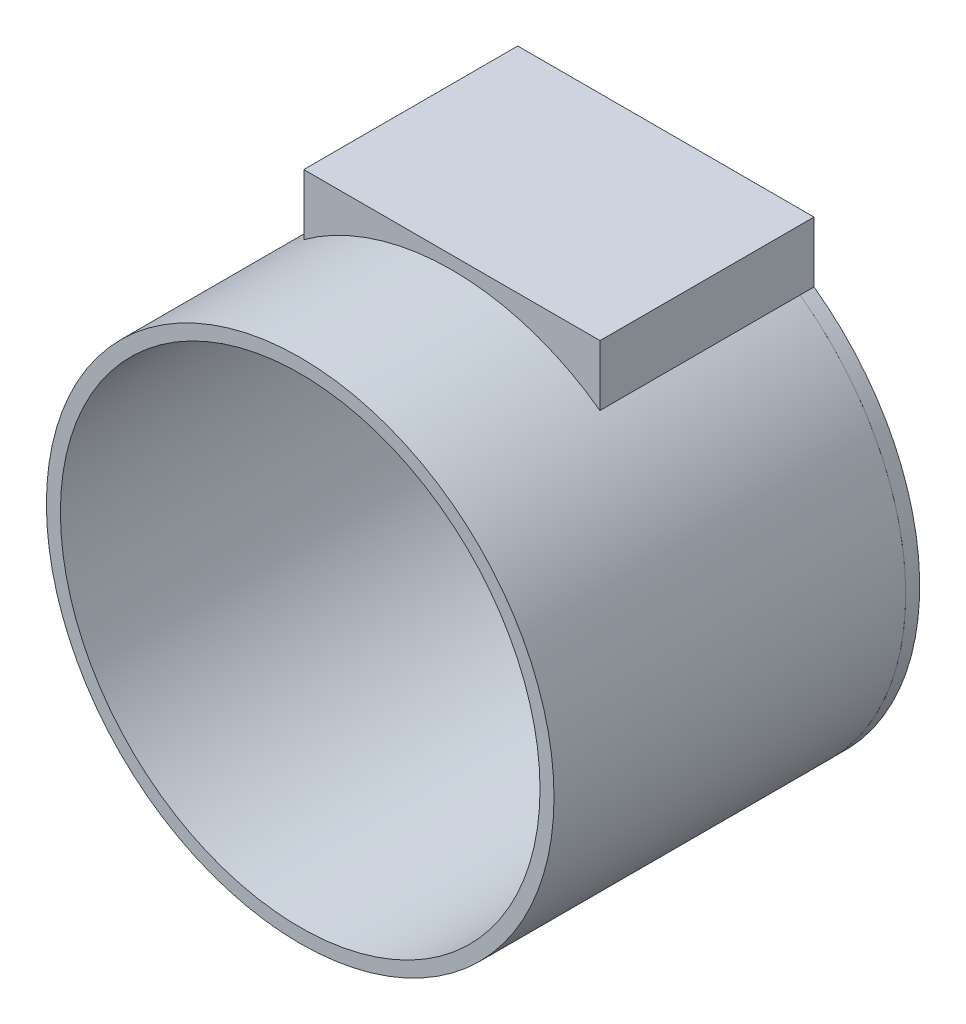
ISO-10303-21;
HEADER;
FILE_DESCRIPTION(('STEP AP214'),'2;1');
FILE_NAME('part.step','',(''),(''),'','','');
FILE_SCHEMA(('AUTOMOTIVE_DESIGN { 1 0 10303 214 1 1 1 1 }'));
ENDSEC;
DATA;
#1=APPLICATION_CONTEXT('core data for automotive mechanical design processes');
#2=APPLICATION_PROTOCOL_DEFINITION('international standard','automotive_design',2000,#1);
#3=PRODUCT_CONTEXT('',#1,'mechanical');
#4=PRODUCT('Part','Part','',(#3));
#5=PRODUCT_RELATED_PRODUCT_CATEGORY('part','',(#4));
#6=PRODUCT_DEFINITION_FORMATION('','',#4);
#7=PRODUCT_DEFINITION_CONTEXT('part definition',#1,'design');
#8=PRODUCT_DEFINITION('design','',#6,#7);
#9=PRODUCT_DEFINITION_SHAPE('','',#8);
#10=(LENGTH_UNIT() NAMED_UNIT(*) SI_UNIT(.MILLI.,.METRE.));
#11=(NAMED_UNIT(*) PLANE_ANGLE_UNIT() SI_UNIT($,.RADIAN.));
#12=(NAMED_UNIT(*) SI_UNIT($,.STERADIAN.) SOLID_ANGLE_UNIT());
#13=UNCERTAINTY_MEASURE_WITH_UNIT(LENGTH_MEASURE(1.E-05),#10,'distance_accuracy_value','');
#14=(GEOMETRIC_REPRESENTATION_CONTEXT(3) GLOBAL_UNCERTAINTY_ASSIGNED_CONTEXT((#13)) GLOBAL_UNIT_ASSIGNED_CONTEXT((#10,
#11,#12)) REPRESENTATION_CONTEXT('',''));
#15=CARTESIAN_POINT('',(0.,0.,0.));
#16=DIRECTION('',(0.,0.,1.));
#17=DIRECTION('',(1.,0.,0.));
#18=AXIS2_PLACEMENT_3D('',#15,#16,#17);
#19=CARTESIAN_POINT('',(0.,0.,62.7));
#20=DIRECTION('',(0.,0.,1.));
#21=DIRECTION('',(1.,0.,0.));
#22=AXIS2_PLACEMENT_3D('',#19,#20,#21);
#23=PLANE('',#22);
#24=CARTESIAN_POINT('',(0.,0.,62.7));
#25=DIRECTION('',(0.,0.,1.));
#26=DIRECTION('',(1.,0.,0.));
#27=AXIS2_PLACEMENT_3D('',#24,#25,#26);
#28=CIRCLE('',#27,43.52);
#29=CARTESIAN_POINT('',(43.52,0.,62.7));
#30=VERTEX_POINT('',#29);
#31=EDGE_CURVE('E146',#30,#30,#28,.T.);
#32=ORIENTED_EDGE('',*,*,#31,.T.);
#33=EDGE_LOOP('',(#32));
#34=FACE_BOUND('',#33,.T.);
#35=CARTESIAN_POINT('',(0.,0.,62.7));
#36=DIRECTION('',(0.,0.,1.));
#37=DIRECTION('',(1.,0.,0.));
#38=AXIS2_PLACEMENT_3D('',#35,#36,#37);
#39=CIRCLE('',#38,41.12);
#40=CARTESIAN_POINT('',(41.12,0.,62.7));
#41=VERTEX_POINT('',#40);
#42=EDGE_CURVE('E140',#41,#41,#39,.T.);
#43=ORIENTED_EDGE('',*,*,#42,.F.);
#44=EDGE_LOOP('',(#43));
#45=FACE_BOUND('',#44,.T.);
#46=ADVANCED_FACE('F51',(#34,#45),#23,.T.);
#47=CARTESIAN_POINT('',(0.,0.,2.4));
#48=DIRECTION('',(0.,0.,1.));
#49=DIRECTION('',(1.,0.,0.));
#50=AXIS2_PLACEMENT_3D('',#47,#48,#49);
#51=PLANE('',#50);
#52=CARTESIAN_POINT('',(0.,0.,2.4));
#53=DIRECTION('',(0.,0.,1.));
#54=DIRECTION('',(1.,0.,0.));
#55=AXIS2_PLACEMENT_3D('',#52,#53,#54);
#56=CIRCLE('',#55,43.52);
#57=CARTESIAN_POINT('',(43.52,0.,2.4));
#58=VERTEX_POINT('',#57);
#59=EDGE_CURVE('E143',#58,#58,#56,.T.);
#60=ORIENTED_EDGE('',*,*,#59,.F.);
#61=EDGE_LOOP('',(#60));
#62=FACE_BOUND('',#61,.T.);
#63=CARTESIAN_POINT('',(0.,0.,2.4));
#64=DIRECTION('',(0.,0.,1.));
#65=DIRECTION('',(1.,0.,0.));
#66=AXIS2_PLACEMENT_3D('',#63,#64,#65);
#67=CIRCLE('',#66,41.12);
#68=CARTESIAN_POINT('',(41.12,0.,2.4));
#69=VERTEX_POINT('',#68);
#70=EDGE_CURVE('E139',#69,#69,#67,.T.);
#71=ORIENTED_EDGE('',*,*,#70,.T.);
#72=EDGE_LOOP('',(#71));
#73=FACE_BOUND('',#72,.T.);
#74=ADVANCED_FACE('F184',(#62,#73),#51,.F.);
#75=CARTESIAN_POINT('',(0.,0.,62.7));
#76=DIRECTION('',(0.,0.,-1.));
#77=DIRECTION('',(-1.,0.,0.));
#78=AXIS2_PLACEMENT_3D('',#75,#76,#77);
#79=CYLINDRICAL_SURFACE('',#78,43.52);
#80=CARTESIAN_POINT('',(0.,0.,4.9));
#81=DIRECTION('',(0.,0.,-1.));
#82=DIRECTION('',(-1.,0.,0.));
#83=AXIS2_PLACEMENT_3D('',#80,#81,#82);
#84=CIRCLE('',#83,43.52);
#85=CARTESIAN_POINT('',(-22.9,37.0078424121158,4.9));
#86=VERTEX_POINT('',#85);
#87=CARTESIAN_POINT('',(22.9,37.0078424121158,4.9));
#88=VERTEX_POINT('',#87);
#89=EDGE_CURVE('E136',#86,#88,#84,.T.);
#90=ORIENTED_EDGE('',*,*,#89,.T.);
#91=DIRECTION('',(0.,0.,-1.));
#92=VECTOR('',#91,1.);
#93=CARTESIAN_POINT('',(22.9,37.0078424121158,62.7));
#94=LINE('',#93,#92);
#95=CARTESIAN_POINT('',(22.9,37.0078424121158,34.19));
#96=VERTEX_POINT('',#95);
#97=EDGE_CURVE('E12',#88,#96,#94,.F.);
#98=ORIENTED_EDGE('',*,*,#97,.T.);
#99=CARTESIAN_POINT('',(0.,0.,34.19));
#100=DIRECTION('',(0.,0.,1.));
#101=DIRECTION('',(1.,0.,0.));
#102=AXIS2_PLACEMENT_3D('',#99,#100,#101);
#103=CIRCLE('',#102,43.52);
#104=CARTESIAN_POINT('',(-22.9,37.0078424121158,34.19));
#105=VERTEX_POINT('',#104);
#106=EDGE_CURVE('E110',#96,#105,#103,.T.);
#107=ORIENTED_EDGE('',*,*,#106,.T.);
#108=DIRECTION('',(0.,0.,-1.));
#109=VECTOR('',#108,1.);
#110=CARTESIAN_POINT('',(-22.9,37.0078424121158,62.7));
#111=LINE('',#110,#109);
#112=EDGE_CURVE('E59',#105,#86,#111,.T.);
#113=ORIENTED_EDGE('',*,*,#112,.T.);
#114=EDGE_LOOP('',(#90,#98,#107,#113));
#115=FACE_BOUND('',#114,.T.);
#116=ORIENTED_EDGE('',*,*,#31,.F.);
#117=EDGE_LOOP('',(#116));
#118=FACE_BOUND('',#117,.T.);
#119=ORIENTED_EDGE('',*,*,#59,.T.);
#120=EDGE_LOOP('',(#119));
#121=FACE_BOUND('',#120,.T.);
#122=ADVANCED_FACE('F53',(#115,#118,#121),#79,.T.);
#123=CARTESIAN_POINT('',(0.,0.,62.7));
#124=DIRECTION('',(0.,0.,-1.));
#125=DIRECTION('',(-1.,0.,0.));
#126=AXIS2_PLACEMENT_3D('',#123,#124,#125);
#127=CYLINDRICAL_SURFACE('',#126,41.12);
#128=DIRECTION('',(0.,0.,-1.));
#129=VECTOR('',#128,1.);
#130=CARTESIAN_POINT('',(-21.0243668156737,35.3387945465037,62.7));
#131=LINE('',#130,#129);
#132=CARTESIAN_POINT('',(-21.0243668156737,35.3387945465037,34.19));
#133=VERTEX_POINT('',#132);
#134=CARTESIAN_POINT('',(-21.0243668156737,35.3387945465037,4.9));
#135=VERTEX_POINT('',#134);
#136=EDGE_CURVE('E156',#133,#135,#131,.T.);
#137=ORIENTED_EDGE('',*,*,#136,.F.);
#138=CARTESIAN_POINT('',(0.,0.,34.19));
#139=DIRECTION('',(0.,0.,1.));
#140=DIRECTION('',(1.,0.,0.));
#141=AXIS2_PLACEMENT_3D('',#138,#139,#140);
#142=CIRCLE('',#141,41.12);
#143=CARTESIAN_POINT('',(21.0243668156737,35.3387945465037,34.19));
#144=VERTEX_POINT('',#143);
#145=EDGE_CURVE('E152',#144,#133,#142,.T.);
#146=ORIENTED_EDGE('',*,*,#145,.F.);
#147=DIRECTION('',(0.,0.,-1.));
#148=VECTOR('',#147,1.);
#149=CARTESIAN_POINT('',(21.0243668156737,35.3387945465037,62.7));
#150=LINE('',#149,#148);
#151=CARTESIAN_POINT('',(21.0243668156737,35.3387945465037,4.9));
#152=VERTEX_POINT('',#151);
#153=EDGE_CURVE('E118',#152,#144,#150,.F.);
#154=ORIENTED_EDGE('',*,*,#153,.F.);
#155=CARTESIAN_POINT('',(0.,0.,4.9));
#156=DIRECTION('',(0.,0.,-1.));
#157=DIRECTION('',(-1.,0.,0.));
#158=AXIS2_PLACEMENT_3D('',#155,#156,#157);
#159=CIRCLE('',#158,41.12);
#160=EDGE_CURVE('E154',#135,#152,#159,.T.);
#161=ORIENTED_EDGE('',*,*,#160,.F.);
#162=EDGE_LOOP('',(#137,#146,#154,#161));
#163=FACE_BOUND('',#162,.T.);
#164=ORIENTED_EDGE('',*,*,#42,.T.);
#165=EDGE_LOOP('',(#164));
#166=FACE_BOUND('',#165,.T.);
#167=ORIENTED_EDGE('',*,*,#70,.F.);
#168=EDGE_LOOP('',(#167));
#169=FACE_BOUND('',#168,.T.);
#170=ADVANCED_FACE('F170',(#163,#166,#169),#127,.F.);
#171=CARTESIAN_POINT('',(22.9,44.3387945465037,4.9));
#172=DIRECTION('',(1.,0.,0.));
#173=DIRECTION('',(0.,0.,-1.));
#174=AXIS2_PLACEMENT_3D('',#171,#172,#173);
#175=PLANE('',#174);
#176=DIRECTION('',(0.,-1.,0.));
#177=VECTOR('',#176,1.);
#178=CARTESIAN_POINT('',(22.9,44.3387945465037,4.9));
#179=LINE('',#178,#177);
#180=CARTESIAN_POINT('',(22.9,35.3387945465037,4.9));
#181=VERTEX_POINT('',#180);
#182=EDGE_CURVE('E124',#88,#181,#179,.T.);
#183=ORIENTED_EDGE('',*,*,#182,.T.);
#184=DIRECTION('',(0.,0.,1.));
#185=VECTOR('',#184,1.);
#186=CARTESIAN_POINT('',(22.9,35.3387945465037,4.9));
#187=LINE('',#186,#185);
#188=CARTESIAN_POINT('',(22.9,35.3387945465037,34.19));
#189=VERTEX_POINT('',#188);
#190=EDGE_CURVE('E116',#181,#189,#187,.T.);
#191=ORIENTED_EDGE('',*,*,#190,.T.);
#192=DIRECTION('',(0.,-1.,0.));
#193=VECTOR('',#192,1.);
#194=CARTESIAN_POINT('',(22.9,44.3387945465037,34.19));
#195=LINE('',#194,#193);
#196=EDGE_CURVE('E104',#96,#189,#195,.T.);
#197=ORIENTED_EDGE('',*,*,#196,.F.);
#198=ORIENTED_EDGE('',*,*,#97,.F.);
#199=EDGE_LOOP('',(#183,#191,#197,#198));
#200=FACE_BOUND('',#199,.T.);
#201=ADVANCED_FACE('F122',(#200),#175,.F.);
#202=CARTESIAN_POINT('',(-22.9,44.3387945465037,34.19));
#203=DIRECTION('',(-1.,0.,0.));
#204=DIRECTION('',(0.,0.,1.));
#205=AXIS2_PLACEMENT_3D('',#202,#203,#204);
#206=PLANE('',#205);
#207=DIRECTION('',(0.,-1.,0.));
#208=VECTOR('',#207,1.);
#209=CARTESIAN_POINT('',(-22.9,44.3387945465037,34.19));
#210=LINE('',#209,#208);
#211=CARTESIAN_POINT('',(-22.9,35.3387945465037,34.19));
#212=VERTEX_POINT('',#211);
#213=EDGE_CURVE('E66',#105,#212,#210,.T.);
#214=ORIENTED_EDGE('',*,*,#213,.T.);
#215=DIRECTION('',(0.,0.,-1.));
#216=VECTOR('',#215,1.);
#217=CARTESIAN_POINT('',(-22.9,35.3387945465037,34.19));
#218=LINE('',#217,#216);
#219=CARTESIAN_POINT('',(-22.9,35.3387945465037,4.9));
#220=VERTEX_POINT('',#219);
#221=EDGE_CURVE('E119',#212,#220,#218,.T.);
#222=ORIENTED_EDGE('',*,*,#221,.T.);
#223=DIRECTION('',(0.,-1.,0.));
#224=VECTOR('',#223,1.);
#225=CARTESIAN_POINT('',(-22.9,44.3387945465037,4.9));
#226=LINE('',#225,#224);
#227=EDGE_CURVE('E132',#86,#220,#226,.T.);
#228=ORIENTED_EDGE('',*,*,#227,.F.);
#229=ORIENTED_EDGE('',*,*,#112,.F.);
#230=EDGE_LOOP('',(#214,#222,#228,#229));
#231=FACE_BOUND('',#230,.T.);
#232=ADVANCED_FACE('F162',(#231),#206,.F.);
#233=CARTESIAN_POINT('',(-22.9,44.3387945465037,4.9));
#234=DIRECTION('',(0.,0.,-1.));
#235=DIRECTION('',(-1.,0.,0.));
#236=AXIS2_PLACEMENT_3D('',#233,#234,#235);
#237=PLANE('',#236);
#238=ORIENTED_EDGE('',*,*,#227,.T.);
#239=DIRECTION('',(1.,0.,0.));
#240=VECTOR('',#239,1.);
#241=CARTESIAN_POINT('',(-22.9,35.3387945465037,4.9));
#242=LINE('',#241,#240);
#243=EDGE_CURVE('E113',#220,#135,#242,.T.);
#244=ORIENTED_EDGE('',*,*,#243,.T.);
#245=ORIENTED_EDGE('',*,*,#160,.T.);
#246=EDGE_CURVE('E74',#152,#181,#242,.T.);
#247=ORIENTED_EDGE('',*,*,#246,.T.);
#248=ORIENTED_EDGE('',*,*,#182,.F.);
#249=ORIENTED_EDGE('',*,*,#89,.F.);
#250=EDGE_LOOP('',(#238,#244,#245,#247,#248,#249));
#251=FACE_BOUND('',#250,.T.);
#252=ADVANCED_FACE('F166',(#251),#237,.F.);
#253=CARTESIAN_POINT('',(22.9,44.3387945465037,34.19));
#254=DIRECTION('',(0.,0.,1.));
#255=DIRECTION('',(1.,0.,0.));
#256=AXIS2_PLACEMENT_3D('',#253,#254,#255);
#257=PLANE('',#256);
#258=ORIENTED_EDGE('',*,*,#196,.T.);
#259=DIRECTION('',(-1.,0.,0.));
#260=VECTOR('',#259,1.);
#261=CARTESIAN_POINT('',(22.9,35.3387945465037,34.19));
#262=LINE('',#261,#260);
#263=EDGE_CURVE('E107',#189,#144,#262,.T.);
#264=ORIENTED_EDGE('',*,*,#263,.T.);
#265=ORIENTED_EDGE('',*,*,#145,.T.);
#266=EDGE_CURVE('E120',#133,#212,#262,.T.);
#267=ORIENTED_EDGE('',*,*,#266,.T.);
#268=ORIENTED_EDGE('',*,*,#213,.F.);
#269=ORIENTED_EDGE('',*,*,#106,.F.);
#270=EDGE_LOOP('',(#258,#264,#265,#267,#268,#269));
#271=FACE_BOUND('',#270,.T.);
#272=ADVANCED_FACE('F106',(#271),#257,.F.);
#273=CARTESIAN_POINT('',(0.,35.3387945465037,0.));
#274=DIRECTION('',(0.,-1.,0.));
#275=DIRECTION('',(0.,0.,-1.));
#276=AXIS2_PLACEMENT_3D('',#273,#274,#275);
#277=PLANE('',#276);
#278=ORIENTED_EDGE('',*,*,#136,.T.);
#279=ORIENTED_EDGE('',*,*,#243,.F.);
#280=ORIENTED_EDGE('',*,*,#221,.F.);
#281=ORIENTED_EDGE('',*,*,#266,.F.);
#282=EDGE_LOOP('',(#278,#279,#280,#281));
#283=FACE_BOUND('',#282,.T.);
#284=ADVANCED_FACE('F174',(#283),#277,.F.);
#285=ORIENTED_EDGE('',*,*,#153,.T.);
#286=ORIENTED_EDGE('',*,*,#263,.F.);
#287=ORIENTED_EDGE('',*,*,#190,.F.);
#288=ORIENTED_EDGE('',*,*,#246,.F.);
#289=EDGE_LOOP('',(#285,#286,#287,#288));
#290=FACE_BOUND('',#289,.T.);
#291=ADVANCED_FACE('F115',(#290),#277,.F.);
#292=CLOSED_SHELL('',(#46,#74,#122,#170,#201,#232,#252,#272,#284,#291));
#293=MANIFOLD_SOLID_BREP('B2',#292);
#294=CARTESIAN_POINT('',(0.,0.,2.4));
#295=DIRECTION('',(0.,0.,-1.));
#296=DIRECTION('',(-1.,0.,0.));
#297=AXIS2_PLACEMENT_3D('',#294,#295,#296);
#298=CYLINDRICAL_SURFACE('',#297,34.);
#299=CARTESIAN_POINT('',(0.,0.,0.));
#300=DIRECTION('',(0.,0.,1.));
#301=DIRECTION('',(1.,0.,0.));
#302=AXIS2_PLACEMENT_3D('',#299,#300,#301);
#303=CIRCLE('',#302,34.);
#304=CARTESIAN_POINT('',(34.,0.,0.));
#305=VERTEX_POINT('',#304);
#306=EDGE_CURVE('E467',#305,#305,#303,.T.);
#307=ORIENTED_EDGE('',*,*,#306,.F.);
#308=EDGE_LOOP('',(#307));
#309=FACE_BOUND('',#308,.T.);
#310=CARTESIAN_POINT('',(0.,0.,0.700000000000006));
#311=DIRECTION('',(0.,0.,1.));
#312=DIRECTION('',(1.,0.,0.));
#313=AXIS2_PLACEMENT_3D('',#310,#311,#312);
#314=CIRCLE('',#313,34.);
#315=CARTESIAN_POINT('',(34.,0.,0.700000000000006));
#316=VERTEX_POINT('',#315);
#317=EDGE_CURVE('E534',#316,#316,#314,.T.);
#318=ORIENTED_EDGE('',*,*,#317,.T.);
#319=EDGE_LOOP('',(#318));
#320=FACE_BOUND('',#319,.T.);
#321=ADVANCED_FACE('F286',(#309,#320),#298,.F.);
#322=CARTESIAN_POINT('',(-19.0500000000001,32.9955678841871,2.4));
#323=DIRECTION('',(0.,0.,-1.));
#324=DIRECTION('',(-1.,0.,0.));
#325=AXIS2_PLACEMENT_3D('',#322,#323,#324);
#326=CYLINDRICAL_SURFACE('',#325,1.97);
#327=CARTESIAN_POINT('',(-19.0500000000001,32.9955678841871,0.));
#328=DIRECTION('',(0.,0.,1.));
#329=DIRECTION('',(1.,0.,0.));
#330=AXIS2_PLACEMENT_3D('',#327,#328,#329);
#331=CIRCLE('',#330,1.97);
#332=CARTESIAN_POINT('',(-17.0800000000001,32.9955678841871,0.));
#333=VERTEX_POINT('',#332);
#334=EDGE_CURVE('E464',#333,#333,#331,.T.);
#335=ORIENTED_EDGE('',*,*,#334,.F.);
#336=EDGE_LOOP('',(#335));
#337=FACE_BOUND('',#336,.T.);
#338=CARTESIAN_POINT('',(-19.0500000000001,32.9955678841871,0.700000000000006));
#339=DIRECTION('',(0.,0.,1.));
#340=DIRECTION('',(1.,0.,0.));
#341=AXIS2_PLACEMENT_3D('',#338,#339,#340);
#342=CIRCLE('',#341,1.97);
#343=CARTESIAN_POINT('',(-17.0800000000001,32.9955678841871,0.700000000000006));
#344=VERTEX_POINT('',#343);
#345=EDGE_CURVE('E531',#344,#344,#342,.T.);
#346=ORIENTED_EDGE('',*,*,#345,.T.);
#347=EDGE_LOOP('',(#346));
#348=FACE_BOUND('',#347,.T.);
#349=ADVANCED_FACE('F583',(#337,#348),#326,.F.);
#350=CARTESIAN_POINT('',(19.05,32.9955678841871,2.4));
#351=DIRECTION('',(0.,0.,-1.));
#352=DIRECTION('',(-1.,0.,0.));
#353=AXIS2_PLACEMENT_3D('',#350,#351,#352);
#354=CYLINDRICAL_SURFACE('',#353,1.97);
#355=CARTESIAN_POINT('',(19.05,32.9955678841871,0.));
#356=DIRECTION('',(0.,0.,1.));
#357=DIRECTION('',(1.,0.,0.));
#358=AXIS2_PLACEMENT_3D('',#355,#356,#357);
#359=CIRCLE('',#358,1.97);
#360=CARTESIAN_POINT('',(21.02,32.9955678841871,0.));
#361=VERTEX_POINT('',#360);
#362=EDGE_CURVE('E461',#361,#361,#359,.T.);
#363=ORIENTED_EDGE('',*,*,#362,.F.);
#364=EDGE_LOOP('',(#363));
#365=FACE_BOUND('',#364,.T.);
#366=CARTESIAN_POINT('',(19.05,32.9955678841871,0.700000000000006));
#367=DIRECTION('',(0.,0.,1.));
#368=DIRECTION('',(1.,0.,0.));
#369=AXIS2_PLACEMENT_3D('',#366,#367,#368);
#370=CIRCLE('',#369,1.97);
#371=CARTESIAN_POINT('',(21.02,32.9955678841871,0.700000000000006));
#372=VERTEX_POINT('',#371);
#373=EDGE_CURVE('E528',#372,#372,#370,.T.);
#374=ORIENTED_EDGE('',*,*,#373,.T.);
#375=EDGE_LOOP('',(#374));
#376=FACE_BOUND('',#375,.T.);
#377=ADVANCED_FACE('F589',(#365,#376),#354,.F.);
#378=CARTESIAN_POINT('',(38.1,-1.17961196366423E-13,2.4));
#379=DIRECTION('',(0.,0.,-1.));
#380=DIRECTION('',(-1.,0.,0.));
#381=AXIS2_PLACEMENT_3D('',#378,#379,#380);
#382=CYLINDRICAL_SURFACE('',#381,1.97);
#383=CARTESIAN_POINT('',(38.1,-1.17961196366423E-13,0.));
#384=DIRECTION('',(0.,0.,1.));
#385=DIRECTION('',(1.,0.,0.));
#386=AXIS2_PLACEMENT_3D('',#383,#384,#385);
#387=CIRCLE('',#386,1.97);
#388=CARTESIAN_POINT('',(40.07,-1.17961196366423E-13,0.));
#389=VERTEX_POINT('',#388);
#390=EDGE_CURVE('E458',#389,#389,#387,.T.);
#391=ORIENTED_EDGE('',*,*,#390,.F.);
#392=EDGE_LOOP('',(#391));
#393=FACE_BOUND('',#392,.T.);
#394=CARTESIAN_POINT('',(38.1,-1.17961196366423E-13,0.700000000000006));
#395=DIRECTION('',(0.,0.,1.));
#396=DIRECTION('',(1.,0.,0.));
#397=AXIS2_PLACEMENT_3D('',#394,#395,#396);
#398=CIRCLE('',#397,1.97);
#399=CARTESIAN_POINT('',(40.07,-1.17961196366423E-13,0.700000000000006));
#400=VERTEX_POINT('',#399);
#401=EDGE_CURVE('E525',#400,#400,#398,.T.);
#402=ORIENTED_EDGE('',*,*,#401,.T.);
#403=EDGE_LOOP('',(#402));
#404=FACE_BOUND('',#403,.T.);
#405=ADVANCED_FACE('F599',(#393,#404),#382,.F.);
#406=CARTESIAN_POINT('',(19.0499999999998,-32.9955678841872,2.4));
#407=DIRECTION('',(0.,0.,-1.));
#408=DIRECTION('',(-1.,0.,0.));
#409=AXIS2_PLACEMENT_3D('',#406,#407,#408);
#410=CYLINDRICAL_SURFACE('',#409,1.97);
#411=CARTESIAN_POINT('',(19.0499999999998,-32.9955678841872,0.));
#412=DIRECTION('',(0.,0.,1.));
#413=DIRECTION('',(1.,0.,0.));
#414=AXIS2_PLACEMENT_3D('',#411,#412,#413);
#415=CIRCLE('',#414,1.97);
#416=CARTESIAN_POINT('',(21.0199999999998,-32.9955678841872,0.));
#417=VERTEX_POINT('',#416);
#418=EDGE_CURVE('E455',#417,#417,#415,.T.);
#419=ORIENTED_EDGE('',*,*,#418,.F.);
#420=EDGE_LOOP('',(#419));
#421=FACE_BOUND('',#420,.T.);
#422=CARTESIAN_POINT('',(19.0499999999998,-32.9955678841872,0.700000000000006));
#423=DIRECTION('',(0.,0.,1.));
#424=DIRECTION('',(1.,0.,0.));
#425=AXIS2_PLACEMENT_3D('',#422,#423,#424);
#426=CIRCLE('',#425,1.97);
#427=CARTESIAN_POINT('',(21.0199999999998,-32.9955678841872,0.700000000000006));
#428=VERTEX_POINT('',#427);
#429=EDGE_CURVE('E522',#428,#428,#426,.T.);
#430=ORIENTED_EDGE('',*,*,#429,.T.);
#431=EDGE_LOOP('',(#430));
#432=FACE_BOUND('',#431,.T.);
#433=ADVANCED_FACE('F603',(#421,#432),#410,.F.);
#434=CARTESIAN_POINT('',(-19.0500000000003,-32.995567884187,2.4));
#435=DIRECTION('',(0.,0.,-1.));
#436=DIRECTION('',(-1.,0.,0.));
#437=AXIS2_PLACEMENT_3D('',#434,#435,#436);
#438=CYLINDRICAL_SURFACE('',#437,1.97);
#439=CARTESIAN_POINT('',(-19.0500000000003,-32.995567884187,0.));
#440=DIRECTION('',(0.,0.,1.));
#441=DIRECTION('',(1.,0.,0.));
#442=AXIS2_PLACEMENT_3D('',#439,#440,#441);
#443=CIRCLE('',#442,1.97);
#444=CARTESIAN_POINT('',(-17.0800000000003,-32.995567884187,0.));
#445=VERTEX_POINT('',#444);
#446=EDGE_CURVE('E452',#445,#445,#443,.T.);
#447=ORIENTED_EDGE('',*,*,#446,.F.);
#448=EDGE_LOOP('',(#447));
#449=FACE_BOUND('',#448,.T.);
#450=CARTESIAN_POINT('',(-19.0500000000003,-32.995567884187,0.700000000000006));
#451=DIRECTION('',(0.,0.,1.));
#452=DIRECTION('',(1.,0.,0.));
#453=AXIS2_PLACEMENT_3D('',#450,#451,#452);
#454=CIRCLE('',#453,1.97);
#455=CARTESIAN_POINT('',(-17.0800000000003,-32.995567884187,0.700000000000006));
#456=VERTEX_POINT('',#455);
#457=EDGE_CURVE('E519',#456,#456,#454,.T.);
#458=ORIENTED_EDGE('',*,*,#457,.T.);
#459=EDGE_LOOP('',(#458));
#460=FACE_BOUND('',#459,.T.);
#461=ADVANCED_FACE('F606',(#449,#460),#438,.F.);
#462=CARTESIAN_POINT('',(-38.1000000000001,-1.45716771982058E-13,2.4));
#463=DIRECTION('',(0.,0.,-1.));
#464=DIRECTION('',(-1.,0.,0.));
#465=AXIS2_PLACEMENT_3D('',#462,#463,#464);
#466=CYLINDRICAL_SURFACE('',#465,1.97000000000054);
#467=CARTESIAN_POINT('',(-38.1000000000001,-1.45716771982058E-13,0.));
#468=DIRECTION('',(0.,0.,1.));
#469=DIRECTION('',(1.,0.,0.));
#470=AXIS2_PLACEMENT_3D('',#467,#468,#469);
#471=CIRCLE('',#470,1.97000000000054);
#472=CARTESIAN_POINT('',(-36.1299999999996,-1.45716771982058E-13,0.));
#473=VERTEX_POINT('',#472);
#474=EDGE_CURVE('E444',#473,#473,#471,.T.);
#475=ORIENTED_EDGE('',*,*,#474,.F.);
#476=EDGE_LOOP('',(#475));
#477=FACE_BOUND('',#476,.T.);
#478=CARTESIAN_POINT('',(-38.1000000000001,-1.45716771982058E-13,0.700000000000006));
#479=DIRECTION('',(0.,0.,1.));
#480=DIRECTION('',(1.,0.,0.));
#481=AXIS2_PLACEMENT_3D('',#478,#479,#480);
#482=CIRCLE('',#481,1.97000000000054);
#483=CARTESIAN_POINT('',(-36.1299999999996,-1.45716771982058E-13,0.700000000000006));
#484=VERTEX_POINT('',#483);
#485=EDGE_CURVE('E290',#484,#484,#482,.T.);
#486=ORIENTED_EDGE('',*,*,#485,.T.);
#487=EDGE_LOOP('',(#486));
#488=FACE_BOUND('',#487,.T.);
#489=ADVANCED_FACE('F288',(#477,#488),#466,.F.);
#490=CARTESIAN_POINT('',(-25.4,35.3387945465037,36.69));
#491=DIRECTION('',(0.,1.,0.));
#492=DIRECTION('',(0.,0.,1.));
#493=AXIS2_PLACEMENT_3D('',#490,#491,#492);
#494=PLANE('',#493);
#495=DIRECTION('',(1.,0.,0.));
#496=VECTOR('',#495,1.);
#497=CARTESIAN_POINT('',(-25.4,35.3387945465037,2.4));
#498=LINE('',#497,#496);
#499=CARTESIAN_POINT('',(-25.4,35.3387945465037,2.4));
#500=VERTEX_POINT('',#499);
#501=CARTESIAN_POINT('',(-21.0243668156737,35.3387945465037,2.4));
#502=VERTEX_POINT('',#501);
#503=EDGE_CURVE('E436',#500,#502,#498,.T.);
#504=ORIENTED_EDGE('',*,*,#503,.T.);
#505=DIRECTION('',(0.,0.,1.));
#506=VECTOR('',#505,1.);
#507=CARTESIAN_POINT('',(-21.0243668156737,35.3387945465037,0.700000000000006));
#508=LINE('',#507,#506);
#509=CARTESIAN_POINT('',(-21.0243668156737,35.3387945465037,4.9));
#510=VERTEX_POINT('',#509);
#511=EDGE_CURVE('E515',#502,#510,#508,.T.);
#512=ORIENTED_EDGE('',*,*,#511,.T.);
#513=DIRECTION('',(1.,0.,0.));
#514=VECTOR('',#513,1.);
#515=CARTESIAN_POINT('',(-22.9,35.3387945465037,4.9));
#516=LINE('',#515,#514);
#517=CARTESIAN_POINT('',(-22.9,35.3387945465037,4.9));
#518=VERTEX_POINT('',#517);
#519=EDGE_CURVE('E409',#518,#510,#516,.T.);
#520=ORIENTED_EDGE('',*,*,#519,.F.);
#521=DIRECTION('',(0.,0.,-1.));
#522=VECTOR('',#521,1.);
#523=CARTESIAN_POINT('',(-22.9,35.3387945465037,34.19));
#524=LINE('',#523,#522);
#525=CARTESIAN_POINT('',(-22.9,35.3387945465037,34.19));
#526=VERTEX_POINT('',#525);
#527=EDGE_CURVE('E399',#526,#518,#524,.T.);
#528=ORIENTED_EDGE('',*,*,#527,.F.);
#529=DIRECTION('',(-1.,0.,0.));
#530=VECTOR('',#529,1.);
#531=CARTESIAN_POINT('',(22.9,35.3387945465037,34.19));
#532=LINE('',#531,#530);
#533=CARTESIAN_POINT('',(-21.0243668156737,35.3387945465037,34.19));
#534=VERTEX_POINT('',#533);
#535=EDGE_CURVE('E400',#534,#526,#532,.T.);
#536=ORIENTED_EDGE('',*,*,#535,.F.);
#537=CARTESIAN_POINT('',(-21.0243668156737,35.3387945465037,36.69));
#538=VERTEX_POINT('',#537);
#539=EDGE_CURVE('E310',#534,#538,#508,.T.);
#540=ORIENTED_EDGE('',*,*,#539,.T.);
#541=DIRECTION('',(1.,0.,0.));
#542=VECTOR('',#541,1.);
#543=CARTESIAN_POINT('',(-25.4,35.3387945465037,36.69));
#544=LINE('',#543,#542);
#545=CARTESIAN_POINT('',(-25.4,35.3387945465037,36.69));
#546=VERTEX_POINT('',#545);
#547=EDGE_CURVE('E424',#546,#538,#544,.T.);
#548=ORIENTED_EDGE('',*,*,#547,.F.);
#549=DIRECTION('',(0.,0.,-1.));
#550=VECTOR('',#549,1.);
#551=CARTESIAN_POINT('',(-25.4,35.3387945465037,36.69));
#552=LINE('',#551,#550);
#553=EDGE_CURVE('E435',#546,#500,#552,.T.);
#554=ORIENTED_EDGE('',*,*,#553,.T.);
#555=EDGE_LOOP('',(#504,#512,#520,#528,#536,#540,#548,#554));
#556=FACE_BOUND('',#555,.T.);
#557=ADVANCED_FACE('F561',(#556),#494,.F.);
#558=CARTESIAN_POINT('',(0.,0.,2.4));
#559=DIRECTION('',(0.,0.,-1.));
#560=DIRECTION('',(-1.,0.,0.));
#561=AXIS2_PLACEMENT_3D('',#558,#559,#560);
#562=CYLINDRICAL_SURFACE('',#561,43.52);
#563=CARTESIAN_POINT('',(0.,0.,0.));
#564=DIRECTION('',(0.,0.,1.));
#565=DIRECTION('',(1.,0.,0.));
#566=AXIS2_PLACEMENT_3D('',#563,#564,#565);
#567=CIRCLE('',#566,43.52);
#568=CARTESIAN_POINT('',(-25.4,35.3387945465037,0.));
#569=VERTEX_POINT('',#568);
#570=CARTESIAN_POINT('',(25.4,35.3387945465037,0.));
#571=VERTEX_POINT('',#570);
#572=EDGE_CURVE('E470',#569,#571,#567,.T.);
#573=ORIENTED_EDGE('',*,*,#572,.T.);
#574=DIRECTION('',(0.,0.,-1.));
#575=VECTOR('',#574,1.);
#576=CARTESIAN_POINT('',(25.4,35.3387945465037,2.4));
#577=LINE('',#576,#575);
#578=CARTESIAN_POINT('',(25.4,35.3387945465037,2.4));
#579=VERTEX_POINT('',#578);
#580=EDGE_CURVE('E295',#579,#571,#577,.T.);
#581=ORIENTED_EDGE('',*,*,#580,.F.);
#582=CARTESIAN_POINT('',(0.,0.,2.4));
#583=DIRECTION('',(0.,0.,1.));
#584=DIRECTION('',(1.,0.,0.));
#585=AXIS2_PLACEMENT_3D('',#582,#583,#584);
#586=CIRCLE('',#585,43.52);
#587=EDGE_CURVE('E445',#500,#579,#586,.T.);
#588=ORIENTED_EDGE('',*,*,#587,.F.);
#589=DIRECTION('',(0.,0.,-1.));
#590=VECTOR('',#589,1.);
#591=CARTESIAN_POINT('',(-25.4,35.3387945465037,2.4));
#592=LINE('',#591,#590);
#593=EDGE_CURVE('E448',#500,#569,#592,.T.);
#594=ORIENTED_EDGE('',*,*,#593,.T.);
#595=EDGE_LOOP('',(#573,#581,#588,#594));
#596=FACE_BOUND('',#595,.T.);
#597=ADVANCED_FACE('F494',(#596),#562,.T.);
#598=CARTESIAN_POINT('',(25.3999999999999,0.,2.4));
#599=DIRECTION('',(-1.,0.,0.));
#600=DIRECTION('',(0.,-1.,0.));
#601=AXIS2_PLACEMENT_3D('',#598,#599,#600);
#602=PLANE('',#601);
#603=DIRECTION('',(0.,1.,0.));
#604=VECTOR('',#603,1.);
#605=CARTESIAN_POINT('',(25.3999999999999,0.,0.));
#606=LINE('',#605,#604);
#607=CARTESIAN_POINT('',(25.4,45.7187945465037,0.));
#608=VERTEX_POINT('',#607);
#609=EDGE_CURVE('E473',#571,#608,#606,.T.);
#610=ORIENTED_EDGE('',*,*,#609,.T.);
#611=DIRECTION('',(0.,0.,-1.));
#612=VECTOR('',#611,1.);
#613=CARTESIAN_POINT('',(25.4,45.7187945465037,2.4));
#614=LINE('',#613,#612);
#615=CARTESIAN_POINT('',(25.4,45.7187945465037,36.69));
#616=VERTEX_POINT('',#615);
#617=EDGE_CURVE('E484',#616,#608,#614,.T.);
#618=ORIENTED_EDGE('',*,*,#617,.F.);
#619=DIRECTION('',(0.,1.,0.));
#620=VECTOR('',#619,1.);
#621=CARTESIAN_POINT('',(25.4,35.3387945465037,36.69));
#622=LINE('',#621,#620);
#623=CARTESIAN_POINT('',(25.4,35.3387945465037,36.69));
#624=VERTEX_POINT('',#623);
#625=EDGE_CURVE('E427',#624,#616,#622,.T.);
#626=ORIENTED_EDGE('',*,*,#625,.F.);
#627=DIRECTION('',(0.,0.,-1.));
#628=VECTOR('',#627,1.);
#629=CARTESIAN_POINT('',(25.4,35.3387945465037,36.69));
#630=LINE('',#629,#628);
#631=EDGE_CURVE('E441',#624,#579,#630,.T.);
#632=ORIENTED_EDGE('',*,*,#631,.T.);
#633=ORIENTED_EDGE('',*,*,#580,.T.);
#634=EDGE_LOOP('',(#610,#618,#626,#632,#633));
#635=FACE_BOUND('',#634,.T.);
#636=ADVANCED_FACE('F489',(#635),#602,.F.);
#637=CARTESIAN_POINT('',(0.,45.7187945465037,2.4));
#638=DIRECTION('',(0.,1.,0.));
#639=DIRECTION('',(0.,0.,1.));
#640=AXIS2_PLACEMENT_3D('',#637,#638,#639);
#641=PLANE('',#640);
#642=DIRECTION('',(1.,0.,0.));
#643=VECTOR('',#642,1.);
#644=CARTESIAN_POINT('',(0.,45.7187945465037,0.));
#645=LINE('',#644,#643);
#646=CARTESIAN_POINT('',(-25.4,45.7187945465037,0.));
#647=VERTEX_POINT('',#646);
#648=EDGE_CURVE('E476',#647,#608,#645,.T.);
#649=ORIENTED_EDGE('',*,*,#648,.F.);
#650=DIRECTION('',(0.,0.,-1.));
#651=VECTOR('',#650,1.);
#652=CARTESIAN_POINT('',(-25.4,45.7187945465037,2.4));
#653=LINE('',#652,#651);
#654=CARTESIAN_POINT('',(-25.4,45.7187945465037,36.69));
#655=VERTEX_POINT('',#654);
#656=EDGE_CURVE('E482',#655,#647,#653,.T.);
#657=ORIENTED_EDGE('',*,*,#656,.F.);
#658=DIRECTION('',(-1.,0.,0.));
#659=VECTOR('',#658,1.);
#660=CARTESIAN_POINT('',(-25.4,45.7187945465037,36.69));
#661=LINE('',#660,#659);
#662=EDGE_CURVE('E430',#616,#655,#661,.T.);
#663=ORIENTED_EDGE('',*,*,#662,.F.);
#664=ORIENTED_EDGE('',*,*,#617,.T.);
#665=EDGE_LOOP('',(#649,#657,#663,#664));
#666=FACE_BOUND('',#665,.T.);
#667=ADVANCED_FACE('F506',(#666),#641,.T.);
#668=CARTESIAN_POINT('',(-25.3999999999999,0.,2.4));
#669=DIRECTION('',(-1.,0.,0.));
#670=DIRECTION('',(0.,-1.,0.));
#671=AXIS2_PLACEMENT_3D('',#668,#669,#670);
#672=PLANE('',#671);
#673=DIRECTION('',(0.,1.,0.));
#674=VECTOR('',#673,1.);
#675=CARTESIAN_POINT('',(-25.3999999999999,0.,0.));
#676=LINE('',#675,#674);
#677=EDGE_CURVE('E449',#569,#647,#676,.T.);
#678=ORIENTED_EDGE('',*,*,#677,.F.);
#679=ORIENTED_EDGE('',*,*,#593,.F.);
#680=ORIENTED_EDGE('',*,*,#553,.F.);
#681=DIRECTION('',(0.,-1.,0.));
#682=VECTOR('',#681,1.);
#683=CARTESIAN_POINT('',(-25.4,35.3387945465037,36.69));
#684=LINE('',#683,#682);
#685=EDGE_CURVE('E433',#655,#546,#684,.T.);
#686=ORIENTED_EDGE('',*,*,#685,.F.);
#687=ORIENTED_EDGE('',*,*,#656,.T.);
#688=EDGE_LOOP('',(#678,#679,#680,#686,#687));
#689=FACE_BOUND('',#688,.T.);
#690=ADVANCED_FACE('F500',(#689),#672,.T.);
#691=CARTESIAN_POINT('',(0.,0.,2.4));
#692=DIRECTION('',(0.,0.,1.));
#693=DIRECTION('',(1.,0.,0.));
#694=AXIS2_PLACEMENT_3D('',#691,#692,#693);
#695=PLANE('',#694);
#696=CARTESIAN_POINT('',(0.,0.,2.4));
#697=DIRECTION('',(0.,0.,1.));
#698=DIRECTION('',(1.,0.,0.));
#699=AXIS2_PLACEMENT_3D('',#696,#697,#698);
#700=CIRCLE('',#699,41.12);
#701=CARTESIAN_POINT('',(21.0243668156737,35.3387945465037,2.4));
#702=VERTEX_POINT('',#701);
#703=EDGE_CURVE('E517',#502,#702,#700,.T.);
#704=ORIENTED_EDGE('',*,*,#703,.F.);
#705=ORIENTED_EDGE('',*,*,#503,.F.);
#706=ORIENTED_EDGE('',*,*,#587,.T.);
#707=EDGE_CURVE('E416',#702,#579,#498,.T.);
#708=ORIENTED_EDGE('',*,*,#707,.F.);
#709=EDGE_LOOP('',(#704,#705,#706,#708));
#710=FACE_BOUND('',#709,.T.);
#711=ADVANCED_FACE('F565',(#710),#695,.T.);
#712=CARTESIAN_POINT('',(0.,0.,0.));
#713=DIRECTION('',(0.,0.,1.));
#714=DIRECTION('',(1.,0.,0.));
#715=AXIS2_PLACEMENT_3D('',#712,#713,#714);
#716=PLANE('',#715);
#717=ORIENTED_EDGE('',*,*,#474,.T.);
#718=EDGE_LOOP('',(#717));
#719=FACE_BOUND('',#718,.T.);
#720=ORIENTED_EDGE('',*,*,#446,.T.);
#721=EDGE_LOOP('',(#720));
#722=FACE_BOUND('',#721,.T.);
#723=ORIENTED_EDGE('',*,*,#418,.T.);
#724=EDGE_LOOP('',(#723));
#725=FACE_BOUND('',#724,.T.);
#726=ORIENTED_EDGE('',*,*,#390,.T.);
#727=EDGE_LOOP('',(#726));
#728=FACE_BOUND('',#727,.T.);
#729=ORIENTED_EDGE('',*,*,#362,.T.);
#730=EDGE_LOOP('',(#729));
#731=FACE_BOUND('',#730,.T.);
#732=ORIENTED_EDGE('',*,*,#334,.T.);
#733=EDGE_LOOP('',(#732));
#734=FACE_BOUND('',#733,.T.);
#735=ORIENTED_EDGE('',*,*,#306,.T.);
#736=EDGE_LOOP('',(#735));
#737=FACE_BOUND('',#736,.T.);
#738=ORIENTED_EDGE('',*,*,#572,.F.);
#739=ORIENTED_EDGE('',*,*,#677,.T.);
#740=ORIENTED_EDGE('',*,*,#648,.T.);
#741=ORIENTED_EDGE('',*,*,#609,.F.);
#742=EDGE_LOOP('',(#738,#739,#740,#741));
#743=FACE_BOUND('',#742,.T.);
#744=ADVANCED_FACE('F498',(#719,#722,#725,#728,#731,#734,#737,#743),#716,.F.);
#745=CARTESIAN_POINT('',(21.0243668156737,35.3387945465037,36.69));
#746=VERTEX_POINT('',#745);
#747=EDGE_CURVE('E392',#746,#624,#544,.T.);
#748=ORIENTED_EDGE('',*,*,#747,.F.);
#749=DIRECTION('',(0.,0.,1.));
#750=VECTOR('',#749,1.);
#751=CARTESIAN_POINT('',(21.0243668156737,35.3387945465037,0.700000000000006));
#752=LINE('',#751,#750);
#753=CARTESIAN_POINT('',(21.0243668156737,35.3387945465037,34.19));
#754=VERTEX_POINT('',#753);
#755=EDGE_CURVE('E380',#746,#754,#752,.F.);
#756=ORIENTED_EDGE('',*,*,#755,.T.);
#757=CARTESIAN_POINT('',(22.9,35.3387945465037,34.19));
#758=VERTEX_POINT('',#757);
#759=EDGE_CURVE('E390',#758,#754,#532,.T.);
#760=ORIENTED_EDGE('',*,*,#759,.F.);
#761=DIRECTION('',(0.,0.,1.));
#762=VECTOR('',#761,1.);
#763=CARTESIAN_POINT('',(22.9,35.3387945465037,4.9));
#764=LINE('',#763,#762);
#765=CARTESIAN_POINT('',(22.9,35.3387945465037,4.9));
#766=VERTEX_POINT('',#765);
#767=EDGE_CURVE('E405',#766,#758,#764,.T.);
#768=ORIENTED_EDGE('',*,*,#767,.F.);
#769=CARTESIAN_POINT('',(21.0243668156737,35.3387945465037,4.9));
#770=VERTEX_POINT('',#769);
#771=EDGE_CURVE('E403',#770,#766,#516,.T.);
#772=ORIENTED_EDGE('',*,*,#771,.F.);
#773=EDGE_CURVE('E302',#770,#702,#752,.F.);
#774=ORIENTED_EDGE('',*,*,#773,.T.);
#775=ORIENTED_EDGE('',*,*,#707,.T.);
#776=ORIENTED_EDGE('',*,*,#631,.F.);
#777=EDGE_LOOP('',(#748,#756,#760,#768,#772,#774,#775,#776));
#778=FACE_BOUND('',#777,.T.);
#779=ADVANCED_FACE('F388',(#778),#494,.F.);
#780=CARTESIAN_POINT('',(0.,0.,36.69));
#781=DIRECTION('',(0.,0.,1.));
#782=DIRECTION('',(1.,0.,0.));
#783=AXIS2_PLACEMENT_3D('',#780,#781,#782);
#784=PLANE('',#783);
#785=CARTESIAN_POINT('',(0.,0.,36.69));
#786=DIRECTION('',(0.,0.,1.));
#787=DIRECTION('',(1.,0.,0.));
#788=AXIS2_PLACEMENT_3D('',#785,#786,#787);
#789=CIRCLE('',#788,41.12);
#790=EDGE_CURVE('E509',#746,#538,#789,.T.);
#791=ORIENTED_EDGE('',*,*,#790,.F.);
#792=ORIENTED_EDGE('',*,*,#747,.T.);
#793=ORIENTED_EDGE('',*,*,#625,.T.);
#794=ORIENTED_EDGE('',*,*,#662,.T.);
#795=ORIENTED_EDGE('',*,*,#685,.T.);
#796=ORIENTED_EDGE('',*,*,#547,.T.);
#797=EDGE_LOOP('',(#791,#792,#793,#794,#795,#796));
#798=FACE_BOUND('',#797,.T.);
#799=ADVANCED_FACE('F508',(#798),#784,.T.);
#800=CARTESIAN_POINT('',(22.9,44.3387945465037,4.9));
#801=DIRECTION('',(1.,0.,0.));
#802=DIRECTION('',(0.,0.,-1.));
#803=AXIS2_PLACEMENT_3D('',#800,#801,#802);
#804=PLANE('',#803);
#805=ORIENTED_EDGE('',*,*,#767,.T.);
#806=DIRECTION('',(0.,-1.,0.));
#807=VECTOR('',#806,1.);
#808=CARTESIAN_POINT('',(22.9,44.3387945465037,34.19));
#809=LINE('',#808,#807);
#810=CARTESIAN_POINT('',(22.9,44.3387945465037,34.19));
#811=VERTEX_POINT('',#810);
#812=EDGE_CURVE('E398',#811,#758,#809,.T.);
#813=ORIENTED_EDGE('',*,*,#812,.F.);
#814=DIRECTION('',(0.,0.,1.));
#815=VECTOR('',#814,1.);
#816=CARTESIAN_POINT('',(22.9,44.3387945465037,4.9));
#817=LINE('',#816,#815);
#818=CARTESIAN_POINT('',(22.9,44.3387945465037,4.9));
#819=VERTEX_POINT('',#818);
#820=EDGE_CURVE('E412',#819,#811,#817,.T.);
#821=ORIENTED_EDGE('',*,*,#820,.F.);
#822=DIRECTION('',(0.,-1.,0.));
#823=VECTOR('',#822,1.);
#824=CARTESIAN_POINT('',(22.9,44.3387945465037,4.9));
#825=LINE('',#824,#823);
#826=EDGE_CURVE('E413',#819,#766,#825,.T.);
#827=ORIENTED_EDGE('',*,*,#826,.T.);
#828=EDGE_LOOP('',(#805,#813,#821,#827));
#829=FACE_BOUND('',#828,.T.);
#830=ADVANCED_FACE('F554',(#829),#804,.F.);
#831=CARTESIAN_POINT('',(-22.9,44.3387945465037,4.9));
#832=DIRECTION('',(0.,0.,-1.));
#833=DIRECTION('',(-1.,0.,0.));
#834=AXIS2_PLACEMENT_3D('',#831,#832,#833);
#835=PLANE('',#834);
#836=ORIENTED_EDGE('',*,*,#519,.T.);
#837=CARTESIAN_POINT('',(0.,0.,4.9));
#838=DIRECTION('',(0.,0.,-1.));
#839=DIRECTION('',(-1.,0.,0.));
#840=AXIS2_PLACEMENT_3D('',#837,#838,#839);
#841=CIRCLE('',#840,41.12);
#842=EDGE_CURVE('E511',#510,#770,#841,.T.);
#843=ORIENTED_EDGE('',*,*,#842,.T.);
#844=ORIENTED_EDGE('',*,*,#771,.T.);
#845=ORIENTED_EDGE('',*,*,#826,.F.);
#846=DIRECTION('',(1.,0.,0.));
#847=VECTOR('',#846,1.);
#848=CARTESIAN_POINT('',(-22.9,44.3387945465037,4.9));
#849=LINE('',#848,#847);
#850=CARTESIAN_POINT('',(-22.9,44.3387945465037,4.9));
#851=VERTEX_POINT('',#850);
#852=EDGE_CURVE('E423',#851,#819,#849,.T.);
#853=ORIENTED_EDGE('',*,*,#852,.F.);
#854=DIRECTION('',(0.,-1.,0.));
#855=VECTOR('',#854,1.);
#856=CARTESIAN_POINT('',(-22.9,44.3387945465037,4.9));
#857=LINE('',#856,#855);
#858=EDGE_CURVE('E417',#851,#518,#857,.T.);
#859=ORIENTED_EDGE('',*,*,#858,.T.);
#860=EDGE_LOOP('',(#836,#843,#844,#845,#853,#859));
#861=FACE_BOUND('',#860,.T.);
#862=ADVANCED_FACE('F551',(#861),#835,.F.);
#863=CARTESIAN_POINT('',(-22.9,44.3387945465037,34.19));
#864=DIRECTION('',(-1.,0.,0.));
#865=DIRECTION('',(0.,0.,1.));
#866=AXIS2_PLACEMENT_3D('',#863,#864,#865);
#867=PLANE('',#866);
#868=ORIENTED_EDGE('',*,*,#527,.T.);
#869=ORIENTED_EDGE('',*,*,#858,.F.);
#870=DIRECTION('',(0.,0.,-1.));
#871=VECTOR('',#870,1.);
#872=CARTESIAN_POINT('',(-22.9,44.3387945465037,34.19));
#873=LINE('',#872,#871);
#874=CARTESIAN_POINT('',(-22.9,44.3387945465037,34.19));
#875=VERTEX_POINT('',#874);
#876=EDGE_CURVE('E542',#875,#851,#873,.T.);
#877=ORIENTED_EDGE('',*,*,#876,.F.);
#878=DIRECTION('',(0.,-1.,0.));
#879=VECTOR('',#878,1.);
#880=CARTESIAN_POINT('',(-22.9,44.3387945465037,34.19));
#881=LINE('',#880,#879);
#882=EDGE_CURVE('E419',#875,#526,#881,.T.);
#883=ORIENTED_EDGE('',*,*,#882,.T.);
#884=EDGE_LOOP('',(#868,#869,#877,#883));
#885=FACE_BOUND('',#884,.T.);
#886=ADVANCED_FACE('F557',(#885),#867,.F.);
#887=CARTESIAN_POINT('',(22.9,44.3387945465037,34.19));
#888=DIRECTION('',(0.,0.,1.));
#889=DIRECTION('',(1.,0.,0.));
#890=AXIS2_PLACEMENT_3D('',#887,#888,#889);
#891=PLANE('',#890);
#892=ORIENTED_EDGE('',*,*,#759,.T.);
#893=CARTESIAN_POINT('',(0.,0.,34.19));
#894=DIRECTION('',(0.,0.,1.));
#895=DIRECTION('',(1.,0.,0.));
#896=AXIS2_PLACEMENT_3D('',#893,#894,#895);
#897=CIRCLE('',#896,41.12);
#898=EDGE_CURVE('E49',#754,#534,#897,.T.);
#899=ORIENTED_EDGE('',*,*,#898,.T.);
#900=ORIENTED_EDGE('',*,*,#535,.T.);
#901=ORIENTED_EDGE('',*,*,#882,.F.);
#902=DIRECTION('',(-1.,0.,0.));
#903=VECTOR('',#902,1.);
#904=CARTESIAN_POINT('',(22.9,44.3387945465037,34.19));
#905=LINE('',#904,#903);
#906=EDGE_CURVE('E539',#811,#875,#905,.T.);
#907=ORIENTED_EDGE('',*,*,#906,.F.);
#908=ORIENTED_EDGE('',*,*,#812,.T.);
#909=EDGE_LOOP('',(#892,#899,#900,#901,#907,#908));
#910=FACE_BOUND('',#909,.T.);
#911=ADVANCED_FACE('F396',(#910),#891,.F.);
#912=CARTESIAN_POINT('',(0.,44.3387945465037,0.));
#913=DIRECTION('',(0.,-1.,0.));
#914=DIRECTION('',(0.,0.,-1.));
#915=AXIS2_PLACEMENT_3D('',#912,#913,#914);
#916=PLANE('',#915);
#917=ORIENTED_EDGE('',*,*,#820,.T.);
#918=ORIENTED_EDGE('',*,*,#906,.T.);
#919=ORIENTED_EDGE('',*,*,#876,.T.);
#920=ORIENTED_EDGE('',*,*,#852,.T.);
#921=EDGE_LOOP('',(#917,#918,#919,#920));
#922=FACE_BOUND('',#921,.T.);
#923=ADVANCED_FACE('F547',(#922),#916,.T.);
#924=CARTESIAN_POINT('',(0.,0.,0.700000000000006));
#925=DIRECTION('',(0.,0.,1.));
#926=DIRECTION('',(1.,0.,0.));
#927=AXIS2_PLACEMENT_3D('',#924,#925,#926);
#928=CYLINDRICAL_SURFACE('',#927,41.12);
#929=ORIENTED_EDGE('',*,*,#790,.T.);
#930=ORIENTED_EDGE('',*,*,#539,.F.);
#931=ORIENTED_EDGE('',*,*,#898,.F.);
#932=ORIENTED_EDGE('',*,*,#755,.F.);
#933=EDGE_LOOP('',(#929,#930,#931,#932));
#934=FACE_BOUND('',#933,.T.);
#935=ADVANCED_FACE('F379',(#934),#928,.F.);
#936=ORIENTED_EDGE('',*,*,#703,.T.);
#937=ORIENTED_EDGE('',*,*,#773,.F.);
#938=ORIENTED_EDGE('',*,*,#842,.F.);
#939=ORIENTED_EDGE('',*,*,#511,.F.);
#940=EDGE_LOOP('',(#936,#937,#938,#939));
#941=FACE_BOUND('',#940,.T.);
#942=CARTESIAN_POINT('',(0.,0.,0.700000000000006));
#943=DIRECTION('',(0.,0.,1.));
#944=DIRECTION('',(1.,0.,0.));
#945=AXIS2_PLACEMENT_3D('',#942,#943,#944);
#946=CIRCLE('',#945,41.12);
#947=CARTESIAN_POINT('',(41.12,0.,0.700000000000006));
#948=VERTEX_POINT('',#947);
#949=EDGE_CURVE('E393',#948,#948,#946,.T.);
#950=ORIENTED_EDGE('',*,*,#949,.F.);
#951=EDGE_LOOP('',(#950));
#952=FACE_BOUND('',#951,.T.);
#953=ADVANCED_FACE('F566',(#941,#952),#928,.F.);
#954=CARTESIAN_POINT('',(0.,0.,0.700000000000006));
#955=DIRECTION('',(0.,0.,1.));
#956=DIRECTION('',(1.,0.,0.));
#957=AXIS2_PLACEMENT_3D('',#954,#955,#956);
#958=PLANE('',#957);
#959=ORIENTED_EDGE('',*,*,#317,.F.);
#960=EDGE_LOOP('',(#959));
#961=FACE_BOUND('',#960,.T.);
#962=ORIENTED_EDGE('',*,*,#345,.F.);
#963=EDGE_LOOP('',(#962));
#964=FACE_BOUND('',#963,.T.);
#965=ORIENTED_EDGE('',*,*,#373,.F.);
#966=EDGE_LOOP('',(#965));
#967=FACE_BOUND('',#966,.T.);
#968=ORIENTED_EDGE('',*,*,#401,.F.);
#969=EDGE_LOOP('',(#968));
#970=FACE_BOUND('',#969,.T.);
#971=ORIENTED_EDGE('',*,*,#429,.F.);
#972=EDGE_LOOP('',(#971));
#973=FACE_BOUND('',#972,.T.);
#974=ORIENTED_EDGE('',*,*,#457,.F.);
#975=EDGE_LOOP('',(#974));
#976=FACE_BOUND('',#975,.T.);
#977=ORIENTED_EDGE('',*,*,#485,.F.);
#978=EDGE_LOOP('',(#977));
#979=FACE_BOUND('',#978,.T.);
#980=ORIENTED_EDGE('',*,*,#949,.T.);
#981=EDGE_LOOP('',(#980));
#982=FACE_BOUND('',#981,.T.);
#983=ADVANCED_FACE('F569',(#961,#964,#967,#970,#973,#976,#979,#982),#958,.T.);
#984=CLOSED_SHELL('',(#321,#349,#377,#405,#433,#461,#489,#557,#597,#636,#667,#690,#711,#744,
#779,#799,#830,#862,#886,#911,#923,#935,#953,#983));
#985=MANIFOLD_SOLID_BREP('B6',#984);
#986=ADVANCED_BREP_SHAPE_REPRESENTATION('',(#18,#293,#985),#14);
#987=SHAPE_DEFINITION_REPRESENTATION(#9,#986);
ENDSEC;
END-ISO-10303-21;
